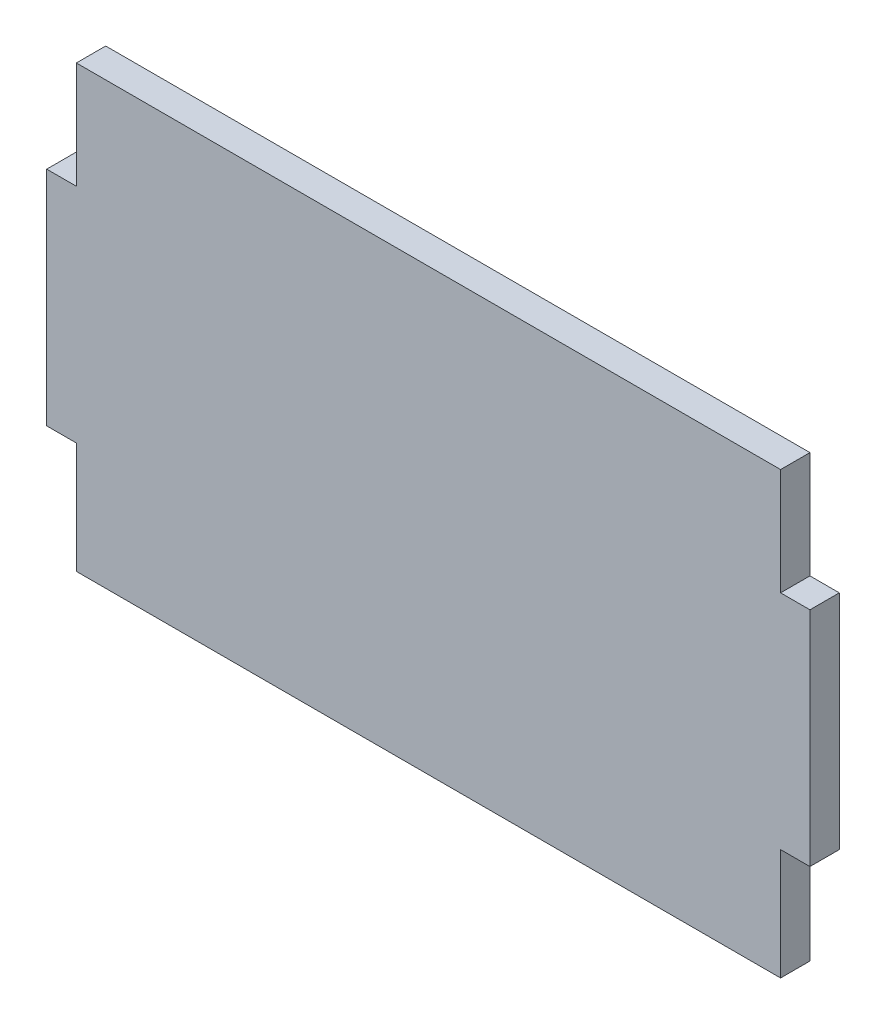
ISO-10303-21;
HEADER;
FILE_DESCRIPTION(('STEP AP214'),'2;1');
FILE_NAME('part.step','',(''),(''),'','','');
FILE_SCHEMA(('AUTOMOTIVE_DESIGN { 1 0 10303 214 1 1 1 1 }'));
ENDSEC;
DATA;
#1=APPLICATION_CONTEXT('core data for automotive mechanical design processes');
#2=APPLICATION_PROTOCOL_DEFINITION('international standard','automotive_design',2000,#1);
#3=PRODUCT_CONTEXT('',#1,'mechanical');
#4=PRODUCT('Part','Part','',(#3));
#5=PRODUCT_RELATED_PRODUCT_CATEGORY('part','',(#4));
#6=PRODUCT_DEFINITION_FORMATION('','',#4);
#7=PRODUCT_DEFINITION_CONTEXT('part definition',#1,'design');
#8=PRODUCT_DEFINITION('design','',#6,#7);
#9=PRODUCT_DEFINITION_SHAPE('','',#8);
#10=(LENGTH_UNIT() NAMED_UNIT(*) SI_UNIT(.MILLI.,.METRE.));
#11=(NAMED_UNIT(*) PLANE_ANGLE_UNIT() SI_UNIT($,.RADIAN.));
#12=(NAMED_UNIT(*) SI_UNIT($,.STERADIAN.) SOLID_ANGLE_UNIT());
#13=UNCERTAINTY_MEASURE_WITH_UNIT(LENGTH_MEASURE(1.E-05),#10,'distance_accuracy_value','');
#14=(GEOMETRIC_REPRESENTATION_CONTEXT(3) GLOBAL_UNCERTAINTY_ASSIGNED_CONTEXT((#13)) GLOBAL_UNIT_ASSIGNED_CONTEXT((#10,
#11,#12)) REPRESENTATION_CONTEXT('',''));
#15=CARTESIAN_POINT('',(0.,0.,0.));
#16=DIRECTION('',(0.,0.,1.));
#17=DIRECTION('',(1.,0.,0.));
#18=AXIS2_PLACEMENT_3D('',#15,#16,#17);
#19=CARTESIAN_POINT('',(0.,0.,2.));
#20=DIRECTION('',(1.,0.,0.));
#21=DIRECTION('',(0.,1.,0.));
#22=AXIS2_PLACEMENT_3D('',#19,#20,#21);
#23=PLANE('',#22);
#24=DIRECTION('',(0.,0.,-1.));
#25=VECTOR('',#24,1.);
#26=CARTESIAN_POINT('',(0.,7.575,2.));
#27=LINE('',#26,#25);
#28=CARTESIAN_POINT('',(0.,7.575,2.));
#29=VERTEX_POINT('',#28);
#30=CARTESIAN_POINT('',(0.,7.575,0.));
#31=VERTEX_POINT('',#30);
#32=EDGE_CURVE('E130',#29,#31,#27,.T.);
#33=ORIENTED_EDGE('',*,*,#32,.F.);
#34=DIRECTION('',(0.,-1.,0.));
#35=VECTOR('',#34,1.);
#36=CARTESIAN_POINT('',(0.,0.,2.));
#37=LINE('',#36,#35);
#38=CARTESIAN_POINT('',(0.,22.725,2.));
#39=VERTEX_POINT('',#38);
#40=EDGE_CURVE('E137',#39,#29,#37,.T.);
#41=ORIENTED_EDGE('',*,*,#40,.F.);
#42=DIRECTION('',(0.,0.,1.));
#43=VECTOR('',#42,1.);
#44=CARTESIAN_POINT('',(0.,22.725,2.));
#45=LINE('',#44,#43);
#46=CARTESIAN_POINT('',(0.,22.725,0.));
#47=VERTEX_POINT('',#46);
#48=EDGE_CURVE('E119',#47,#39,#45,.T.);
#49=ORIENTED_EDGE('',*,*,#48,.F.);
#50=DIRECTION('',(0.,-1.,0.));
#51=VECTOR('',#50,1.);
#52=CARTESIAN_POINT('',(0.,0.,0.));
#53=LINE('',#52,#51);
#54=EDGE_CURVE('E161',#47,#31,#53,.T.);
#55=ORIENTED_EDGE('',*,*,#54,.T.);
#56=EDGE_LOOP('',(#33,#41,#49,#55));
#57=FACE_BOUND('',#56,.T.);
#58=ADVANCED_FACE('F32',(#57),#23,.F.);
#59=CARTESIAN_POINT('',(0.,0.,2.));
#60=DIRECTION('',(0.,1.,0.));
#61=DIRECTION('',(0.,0.,1.));
#62=AXIS2_PLACEMENT_3D('',#59,#60,#61);
#63=PLANE('',#62);
#64=DIRECTION('',(0.,0.,-1.));
#65=VECTOR('',#64,1.);
#66=CARTESIAN_POINT('',(2.01999999999999,0.,2.));
#67=LINE('',#66,#65);
#68=CARTESIAN_POINT('',(2.01999999999999,0.,2.));
#69=VERTEX_POINT('',#68);
#70=CARTESIAN_POINT('',(2.01999999999999,0.,0.));
#71=VERTEX_POINT('',#70);
#72=EDGE_CURVE('E200',#69,#71,#67,.T.);
#73=ORIENTED_EDGE('',*,*,#72,.T.);
#74=DIRECTION('',(1.,0.,0.));
#75=VECTOR('',#74,1.);
#76=CARTESIAN_POINT('',(0.,0.,0.));
#77=LINE('',#76,#75);
#78=CARTESIAN_POINT('',(50.,0.,0.));
#79=VERTEX_POINT('',#78);
#80=EDGE_CURVE('E163',#71,#79,#77,.T.);
#81=ORIENTED_EDGE('',*,*,#80,.T.);
#82=DIRECTION('',(0.,0.,-1.));
#83=VECTOR('',#82,1.);
#84=CARTESIAN_POINT('',(50.,0.,2.));
#85=LINE('',#84,#83);
#86=CARTESIAN_POINT('',(50.,0.,2.));
#87=VERTEX_POINT('',#86);
#88=EDGE_CURVE('E191',#87,#79,#85,.T.);
#89=ORIENTED_EDGE('',*,*,#88,.F.);
#90=DIRECTION('',(1.,0.,0.));
#91=VECTOR('',#90,1.);
#92=CARTESIAN_POINT('',(0.,0.,2.));
#93=LINE('',#92,#91);
#94=EDGE_CURVE('E143',#69,#87,#93,.T.);
#95=ORIENTED_EDGE('',*,*,#94,.F.);
#96=EDGE_LOOP('',(#73,#81,#89,#95));
#97=FACE_BOUND('',#96,.T.);
#98=ADVANCED_FACE('F246',(#97),#63,.F.);
#99=CARTESIAN_POINT('',(52.,0.,2.));
#100=DIRECTION('',(-1.,0.,0.));
#101=DIRECTION('',(0.,-1.,0.));
#102=AXIS2_PLACEMENT_3D('',#99,#100,#101);
#103=PLANE('',#102);
#104=DIRECTION('',(0.,0.,1.));
#105=VECTOR('',#104,1.);
#106=CARTESIAN_POINT('',(52.,7.575,2.));
#107=LINE('',#106,#105);
#108=CARTESIAN_POINT('',(52.,7.575,0.));
#109=VERTEX_POINT('',#108);
#110=CARTESIAN_POINT('',(52.,7.575,2.));
#111=VERTEX_POINT('',#110);
#112=EDGE_CURVE('E215',#109,#111,#107,.T.);
#113=ORIENTED_EDGE('',*,*,#112,.F.);
#114=DIRECTION('',(0.,1.,0.));
#115=VECTOR('',#114,1.);
#116=CARTESIAN_POINT('',(52.,0.,0.));
#117=LINE('',#116,#115);
#118=CARTESIAN_POINT('',(52.,22.725,0.));
#119=VERTEX_POINT('',#118);
#120=EDGE_CURVE('E150',#109,#119,#117,.T.);
#121=ORIENTED_EDGE('',*,*,#120,.T.);
#122=DIRECTION('',(0.,0.,-1.));
#123=VECTOR('',#122,1.);
#124=CARTESIAN_POINT('',(52.,22.725,2.));
#125=LINE('',#124,#123);
#126=CARTESIAN_POINT('',(52.,22.725,2.));
#127=VERTEX_POINT('',#126);
#128=EDGE_CURVE('E202',#127,#119,#125,.T.);
#129=ORIENTED_EDGE('',*,*,#128,.F.);
#130=DIRECTION('',(0.,1.,0.));
#131=VECTOR('',#130,1.);
#132=CARTESIAN_POINT('',(52.,0.,2.));
#133=LINE('',#132,#131);
#134=EDGE_CURVE('E147',#111,#127,#133,.T.);
#135=ORIENTED_EDGE('',*,*,#134,.F.);
#136=EDGE_LOOP('',(#113,#121,#129,#135));
#137=FACE_BOUND('',#136,.T.);
#138=ADVANCED_FACE('F236',(#137),#103,.F.);
#139=CARTESIAN_POINT('',(0.,30.,2.));
#140=DIRECTION('',(0.,-1.,0.));
#141=DIRECTION('',(0.,0.,-1.));
#142=AXIS2_PLACEMENT_3D('',#139,#140,#141);
#143=PLANE('',#142);
#144=DIRECTION('',(0.,0.,-1.));
#145=VECTOR('',#144,1.);
#146=CARTESIAN_POINT('',(2.01999999999999,30.,2.));
#147=LINE('',#146,#145);
#148=CARTESIAN_POINT('',(2.01999999999999,30.,2.));
#149=VERTEX_POINT('',#148);
#150=CARTESIAN_POINT('',(2.01999999999999,30.,0.));
#151=VERTEX_POINT('',#150);
#152=EDGE_CURVE('E153',#149,#151,#147,.T.);
#153=ORIENTED_EDGE('',*,*,#152,.F.);
#154=DIRECTION('',(-1.,0.,0.));
#155=VECTOR('',#154,1.);
#156=CARTESIAN_POINT('',(0.,30.,2.));
#157=LINE('',#156,#155);
#158=CARTESIAN_POINT('',(50.,30.,2.));
#159=VERTEX_POINT('',#158);
#160=EDGE_CURVE('E158',#159,#149,#157,.T.);
#161=ORIENTED_EDGE('',*,*,#160,.F.);
#162=DIRECTION('',(0.,0.,-1.));
#163=VECTOR('',#162,1.);
#164=CARTESIAN_POINT('',(50.,30.,2.));
#165=LINE('',#164,#163);
#166=CARTESIAN_POINT('',(50.,30.,0.));
#167=VERTEX_POINT('',#166);
#168=EDGE_CURVE('E216',#159,#167,#165,.T.);
#169=ORIENTED_EDGE('',*,*,#168,.T.);
#170=DIRECTION('',(-1.,0.,0.));
#171=VECTOR('',#170,1.);
#172=CARTESIAN_POINT('',(0.,30.,0.));
#173=LINE('',#172,#171);
#174=EDGE_CURVE('E144',#167,#151,#173,.T.);
#175=ORIENTED_EDGE('',*,*,#174,.T.);
#176=EDGE_LOOP('',(#153,#161,#169,#175));
#177=FACE_BOUND('',#176,.T.);
#178=ADVANCED_FACE('F223',(#177),#143,.F.);
#179=CARTESIAN_POINT('',(0.,0.,2.));
#180=DIRECTION('',(0.,0.,-1.));
#181=DIRECTION('',(-1.,0.,0.));
#182=AXIS2_PLACEMENT_3D('',#179,#180,#181);
#183=PLANE('',#182);
#184=DIRECTION('',(0.,-1.,0.));
#185=VECTOR('',#184,1.);
#186=CARTESIAN_POINT('',(2.01999999999999,0.,2.));
#187=LINE('',#186,#185);
#188=CARTESIAN_POINT('',(2.01999999999999,7.575,2.));
#189=VERTEX_POINT('',#188);
#190=EDGE_CURVE('E190',#189,#69,#187,.T.);
#191=ORIENTED_EDGE('',*,*,#190,.T.);
#192=ORIENTED_EDGE('',*,*,#94,.T.);
#193=DIRECTION('',(0.,-1.,0.));
#194=VECTOR('',#193,1.);
#195=CARTESIAN_POINT('',(50.,0.,2.));
#196=LINE('',#195,#194);
#197=CARTESIAN_POINT('',(50.,7.575,2.));
#198=VERTEX_POINT('',#197);
#199=EDGE_CURVE('E211',#198,#87,#196,.T.);
#200=ORIENTED_EDGE('',*,*,#199,.F.);
#201=DIRECTION('',(1.,0.,0.));
#202=VECTOR('',#201,1.);
#203=CARTESIAN_POINT('',(50.,7.575,2.));
#204=LINE('',#203,#202);
#205=EDGE_CURVE('E208',#198,#111,#204,.T.);
#206=ORIENTED_EDGE('',*,*,#205,.T.);
#207=ORIENTED_EDGE('',*,*,#134,.T.);
#208=DIRECTION('',(1.,0.,0.));
#209=VECTOR('',#208,1.);
#210=CARTESIAN_POINT('',(50.,22.725,2.));
#211=LINE('',#210,#209);
#212=CARTESIAN_POINT('',(50.,22.725,2.));
#213=VERTEX_POINT('',#212);
#214=EDGE_CURVE('E207',#213,#127,#211,.T.);
#215=ORIENTED_EDGE('',*,*,#214,.F.);
#216=EDGE_CURVE('E194',#159,#213,#196,.T.);
#217=ORIENTED_EDGE('',*,*,#216,.F.);
#218=ORIENTED_EDGE('',*,*,#160,.T.);
#219=CARTESIAN_POINT('',(2.01999999999999,22.725,2.));
#220=VERTEX_POINT('',#219);
#221=EDGE_CURVE('E139',#149,#220,#187,.T.);
#222=ORIENTED_EDGE('',*,*,#221,.T.);
#223=DIRECTION('',(1.,0.,0.));
#224=VECTOR('',#223,1.);
#225=CARTESIAN_POINT('',(0.,22.725,2.));
#226=LINE('',#225,#224);
#227=EDGE_CURVE('E122',#39,#220,#226,.T.);
#228=ORIENTED_EDGE('',*,*,#227,.F.);
#229=ORIENTED_EDGE('',*,*,#40,.T.);
#230=DIRECTION('',(1.,0.,0.));
#231=VECTOR('',#230,1.);
#232=CARTESIAN_POINT('',(0.,7.575,2.));
#233=LINE('',#232,#231);
#234=EDGE_CURVE('E140',#29,#189,#233,.T.);
#235=ORIENTED_EDGE('',*,*,#234,.T.);
#236=EDGE_LOOP('',(#191,#192,#200,#206,#207,#215,#217,#218,#222,#228,#229,#235));
#237=FACE_BOUND('',#236,.T.);
#238=ADVANCED_FACE('F135',(#237),#183,.F.);
#239=CARTESIAN_POINT('',(0.,0.,0.));
#240=DIRECTION('',(0.,0.,-1.));
#241=DIRECTION('',(-1.,0.,0.));
#242=AXIS2_PLACEMENT_3D('',#239,#240,#241);
#243=PLANE('',#242);
#244=ORIENTED_EDGE('',*,*,#80,.F.);
#245=DIRECTION('',(0.,1.,0.));
#246=VECTOR('',#245,1.);
#247=CARTESIAN_POINT('',(2.01999999999999,0.,0.));
#248=LINE('',#247,#246);
#249=CARTESIAN_POINT('',(2.01999999999999,7.575,0.));
#250=VERTEX_POINT('',#249);
#251=EDGE_CURVE('E11',#71,#250,#248,.T.);
#252=ORIENTED_EDGE('',*,*,#251,.T.);
#253=DIRECTION('',(-1.,0.,0.));
#254=VECTOR('',#253,1.);
#255=CARTESIAN_POINT('',(0.,7.575,0.));
#256=LINE('',#255,#254);
#257=EDGE_CURVE('E35',#250,#31,#256,.T.);
#258=ORIENTED_EDGE('',*,*,#257,.T.);
#259=ORIENTED_EDGE('',*,*,#54,.F.);
#260=DIRECTION('',(1.,0.,0.));
#261=VECTOR('',#260,1.);
#262=CARTESIAN_POINT('',(0.,22.725,0.));
#263=LINE('',#262,#261);
#264=CARTESIAN_POINT('',(2.01999999999999,22.725,0.));
#265=VERTEX_POINT('',#264);
#266=EDGE_CURVE('E125',#47,#265,#263,.T.);
#267=ORIENTED_EDGE('',*,*,#266,.T.);
#268=EDGE_CURVE('E40',#265,#151,#248,.T.);
#269=ORIENTED_EDGE('',*,*,#268,.T.);
#270=ORIENTED_EDGE('',*,*,#174,.F.);
#271=DIRECTION('',(0.,1.,0.));
#272=VECTOR('',#271,1.);
#273=CARTESIAN_POINT('',(50.,0.,0.));
#274=LINE('',#273,#272);
#275=CARTESIAN_POINT('',(50.,22.725,0.));
#276=VERTEX_POINT('',#275);
#277=EDGE_CURVE('E170',#276,#167,#274,.T.);
#278=ORIENTED_EDGE('',*,*,#277,.F.);
#279=DIRECTION('',(1.,0.,0.));
#280=VECTOR('',#279,1.);
#281=CARTESIAN_POINT('',(0.,22.725,0.));
#282=LINE('',#281,#280);
#283=EDGE_CURVE('E160',#276,#119,#282,.T.);
#284=ORIENTED_EDGE('',*,*,#283,.T.);
#285=ORIENTED_EDGE('',*,*,#120,.F.);
#286=DIRECTION('',(-1.,0.,0.));
#287=VECTOR('',#286,1.);
#288=CARTESIAN_POINT('',(0.,7.575,0.));
#289=LINE('',#288,#287);
#290=CARTESIAN_POINT('',(50.,7.575,0.));
#291=VERTEX_POINT('',#290);
#292=EDGE_CURVE('E172',#109,#291,#289,.T.);
#293=ORIENTED_EDGE('',*,*,#292,.T.);
#294=EDGE_CURVE('E173',#79,#291,#274,.T.);
#295=ORIENTED_EDGE('',*,*,#294,.F.);
#296=EDGE_LOOP('',(#244,#252,#258,#259,#267,#269,#270,#278,#284,#285,#293,#295));
#297=FACE_BOUND('',#296,.T.);
#298=ADVANCED_FACE('F181',(#297),#243,.T.);
#299=CARTESIAN_POINT('',(50.,22.725,2.));
#300=DIRECTION('',(0.,1.,0.));
#301=DIRECTION('',(0.,0.,1.));
#302=AXIS2_PLACEMENT_3D('',#299,#300,#301);
#303=PLANE('',#302);
#304=ORIENTED_EDGE('',*,*,#128,.T.);
#305=ORIENTED_EDGE('',*,*,#283,.F.);
#306=DIRECTION('',(0.,0.,1.));
#307=VECTOR('',#306,1.);
#308=CARTESIAN_POINT('',(50.,22.725,2.));
#309=LINE('',#308,#307);
#310=EDGE_CURVE('E204',#276,#213,#309,.T.);
#311=ORIENTED_EDGE('',*,*,#310,.T.);
#312=ORIENTED_EDGE('',*,*,#214,.T.);
#313=EDGE_LOOP('',(#304,#305,#311,#312));
#314=FACE_BOUND('',#313,.T.);
#315=ADVANCED_FACE('F231',(#314),#303,.T.);
#316=CARTESIAN_POINT('',(50.,0.,2.));
#317=DIRECTION('',(-1.,0.,0.));
#318=DIRECTION('',(0.,0.,1.));
#319=AXIS2_PLACEMENT_3D('',#316,#317,#318);
#320=PLANE('',#319);
#321=ORIENTED_EDGE('',*,*,#216,.T.);
#322=ORIENTED_EDGE('',*,*,#310,.F.);
#323=ORIENTED_EDGE('',*,*,#277,.T.);
#324=ORIENTED_EDGE('',*,*,#168,.F.);
#325=EDGE_LOOP('',(#321,#322,#323,#324));
#326=FACE_BOUND('',#325,.T.);
#327=ADVANCED_FACE('F228',(#326),#320,.F.);
#328=CARTESIAN_POINT('',(50.,7.575,2.));
#329=DIRECTION('',(0.,-1.,0.));
#330=DIRECTION('',(0.,0.,-1.));
#331=AXIS2_PLACEMENT_3D('',#328,#329,#330);
#332=PLANE('',#331);
#333=ORIENTED_EDGE('',*,*,#112,.T.);
#334=ORIENTED_EDGE('',*,*,#205,.F.);
#335=DIRECTION('',(0.,0.,-1.));
#336=VECTOR('',#335,1.);
#337=CARTESIAN_POINT('',(50.,7.575,2.));
#338=LINE('',#337,#336);
#339=EDGE_CURVE('E55',#198,#291,#338,.T.);
#340=ORIENTED_EDGE('',*,*,#339,.T.);
#341=ORIENTED_EDGE('',*,*,#292,.F.);
#342=EDGE_LOOP('',(#333,#334,#340,#341));
#343=FACE_BOUND('',#342,.T.);
#344=ADVANCED_FACE('F238',(#343),#332,.T.);
#345=ORIENTED_EDGE('',*,*,#294,.T.);
#346=ORIENTED_EDGE('',*,*,#339,.F.);
#347=ORIENTED_EDGE('',*,*,#199,.T.);
#348=ORIENTED_EDGE('',*,*,#88,.T.);
#349=EDGE_LOOP('',(#345,#346,#347,#348));
#350=FACE_BOUND('',#349,.T.);
#351=ADVANCED_FACE('F243',(#350),#320,.F.);
#352=CARTESIAN_POINT('',(0.,22.725,2.));
#353=DIRECTION('',(0.,1.,0.));
#354=DIRECTION('',(0.,0.,1.));
#355=AXIS2_PLACEMENT_3D('',#352,#353,#354);
#356=PLANE('',#355);
#357=ORIENTED_EDGE('',*,*,#48,.T.);
#358=ORIENTED_EDGE('',*,*,#227,.T.);
#359=DIRECTION('',(0.,0.,1.));
#360=VECTOR('',#359,1.);
#361=CARTESIAN_POINT('',(2.01999999999999,22.725,2.));
#362=LINE('',#361,#360);
#363=EDGE_CURVE('E47',#265,#220,#362,.T.);
#364=ORIENTED_EDGE('',*,*,#363,.F.);
#365=ORIENTED_EDGE('',*,*,#266,.F.);
#366=EDGE_LOOP('',(#357,#358,#364,#365));
#367=FACE_BOUND('',#366,.T.);
#368=ADVANCED_FACE('F121',(#367),#356,.T.);
#369=CARTESIAN_POINT('',(2.01999999999999,0.,2.));
#370=DIRECTION('',(-1.,0.,0.));
#371=DIRECTION('',(0.,0.,1.));
#372=AXIS2_PLACEMENT_3D('',#369,#370,#371);
#373=PLANE('',#372);
#374=ORIENTED_EDGE('',*,*,#152,.T.);
#375=ORIENTED_EDGE('',*,*,#268,.F.);
#376=ORIENTED_EDGE('',*,*,#363,.T.);
#377=ORIENTED_EDGE('',*,*,#221,.F.);
#378=EDGE_LOOP('',(#374,#375,#376,#377));
#379=FACE_BOUND('',#378,.T.);
#380=ADVANCED_FACE('F222',(#379),#373,.T.);
#381=ORIENTED_EDGE('',*,*,#72,.F.);
#382=ORIENTED_EDGE('',*,*,#190,.F.);
#383=DIRECTION('',(0.,0.,-1.));
#384=VECTOR('',#383,1.);
#385=CARTESIAN_POINT('',(2.01999999999999,7.575,2.));
#386=LINE('',#385,#384);
#387=EDGE_CURVE('E185',#189,#250,#386,.T.);
#388=ORIENTED_EDGE('',*,*,#387,.T.);
#389=ORIENTED_EDGE('',*,*,#251,.F.);
#390=EDGE_LOOP('',(#381,#382,#388,#389));
#391=FACE_BOUND('',#390,.T.);
#392=ADVANCED_FACE('F188',(#391),#373,.T.);
#393=CARTESIAN_POINT('',(0.,7.575,2.));
#394=DIRECTION('',(0.,-1.,0.));
#395=DIRECTION('',(0.,0.,-1.));
#396=AXIS2_PLACEMENT_3D('',#393,#394,#395);
#397=PLANE('',#396);
#398=ORIENTED_EDGE('',*,*,#387,.F.);
#399=ORIENTED_EDGE('',*,*,#234,.F.);
#400=ORIENTED_EDGE('',*,*,#32,.T.);
#401=ORIENTED_EDGE('',*,*,#257,.F.);
#402=EDGE_LOOP('',(#398,#399,#400,#401));
#403=FACE_BOUND('',#402,.T.);
#404=ADVANCED_FACE('F184',(#403),#397,.T.);
#405=CLOSED_SHELL('',(#58,#98,#138,#178,#238,#298,#315,#327,#344,#351,#368,#380,#392,#404));
#406=MANIFOLD_SOLID_BREP('B2',#405);
#407=ADVANCED_BREP_SHAPE_REPRESENTATION('',(#18,#406),#14);
#408=SHAPE_DEFINITION_REPRESENTATION(#9,#407);
ENDSEC;
END-ISO-10303-21;
